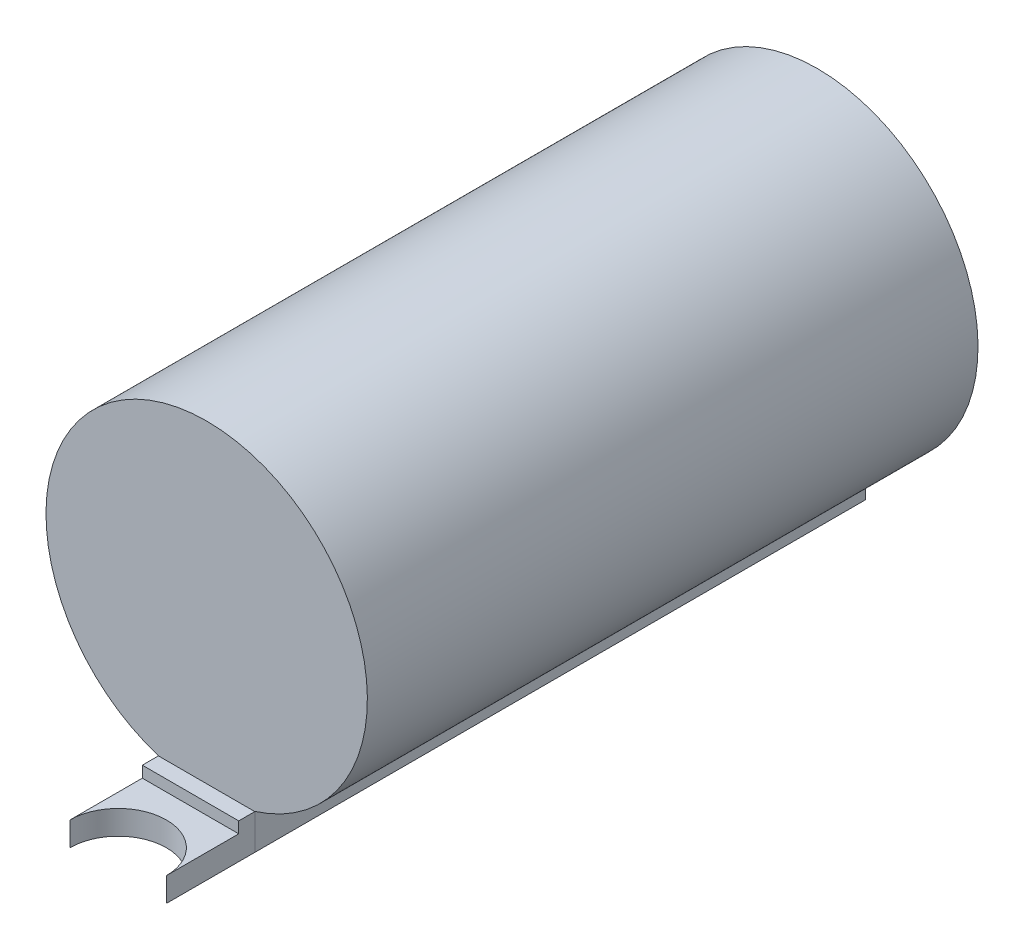
ISO-10303-21;
HEADER;
FILE_DESCRIPTION(('STEP AP214'),'2;1');
FILE_NAME('part.step','',(''),(''),'','','');
FILE_SCHEMA(('AUTOMOTIVE_DESIGN { 1 0 10303 214 1 1 1 1 }'));
ENDSEC;
DATA;
#1=APPLICATION_CONTEXT('core data for automotive mechanical design processes');
#2=APPLICATION_PROTOCOL_DEFINITION('international standard','automotive_design',2000,#1);
#3=PRODUCT_CONTEXT('',#1,'mechanical');
#4=PRODUCT('Part','Part','',(#3));
#5=PRODUCT_RELATED_PRODUCT_CATEGORY('part','',(#4));
#6=PRODUCT_DEFINITION_FORMATION('','',#4);
#7=PRODUCT_DEFINITION_CONTEXT('part definition',#1,'design');
#8=PRODUCT_DEFINITION('design','',#6,#7);
#9=PRODUCT_DEFINITION_SHAPE('','',#8);
#10=(LENGTH_UNIT() NAMED_UNIT(*) SI_UNIT(.MILLI.,.METRE.));
#11=(NAMED_UNIT(*) PLANE_ANGLE_UNIT() SI_UNIT($,.RADIAN.));
#12=(NAMED_UNIT(*) SI_UNIT($,.STERADIAN.) SOLID_ANGLE_UNIT());
#13=UNCERTAINTY_MEASURE_WITH_UNIT(LENGTH_MEASURE(1.E-05),#10,'distance_accuracy_value','');
#14=(GEOMETRIC_REPRESENTATION_CONTEXT(3) GLOBAL_UNCERTAINTY_ASSIGNED_CONTEXT((#13)) GLOBAL_UNIT_ASSIGNED_CONTEXT((#10,
#11,#12)) REPRESENTATION_CONTEXT('',''));
#15=CARTESIAN_POINT('',(0.,0.,0.));
#16=DIRECTION('',(0.,0.,1.));
#17=DIRECTION('',(1.,0.,0.));
#18=AXIS2_PLACEMENT_3D('',#15,#16,#17);
#19=CARTESIAN_POINT('',(52.9064217876975,86.5918418577078,263.612049091514));
#20=DIRECTION('',(0.000492573763945785,0.999999878685536,0.));
#21=DIRECTION('',(0.,0.,-1.));
#22=AXIS2_PLACEMENT_3D('',#19,#20,#21);
#23=PLANE('',#22);
#24=CARTESIAN_POINT('',(52.9064219934912,86.5918418576064,266.612049091514));
#25=DIRECTION('',(0.00049257376394578,0.999999878685536,0.));
#26=DIRECTION('',(0.999999878685536,-0.00049257376394578,0.));
#27=AXIS2_PLACEMENT_3D('',#24,#25,#26);
#28=CIRCLE('',#27,6.);
#29=CARTESIAN_POINT('',(58.9064208540171,86.5888864152255,266.612049091514));
#30=VERTEX_POINT('',#29);
#31=CARTESIAN_POINT('',(46.9064223097906,86.5947973003929,266.612049091514));
#32=VERTEX_POINT('',#31);
#33=EDGE_CURVE('P0_E11',#30,#32,#28,.T.);
#34=ORIENTED_EDGE('',*,*,#33,.T.);
#35=DIRECTION('',(0.,0.,1.));
#36=VECTOR('',#35,1.);
#37=CARTESIAN_POINT('',(46.9064223097906,86.5947973003929,179.612049091514));
#38=LINE('',#37,#36);
#39=CARTESIAN_POINT('',(46.9064226282379,86.594797300236,255.612049091514));
#40=VERTEX_POINT('',#39);
#41=EDGE_CURVE('P0_E129',#40,#32,#38,.T.);
#42=ORIENTED_EDGE('',*,*,#41,.F.);
#43=DIRECTION('',(0.999999878685536,-0.000492573763945785,0.));
#44=VECTOR('',#43,1.);
#45=CARTESIAN_POINT('',(46.9064226282379,86.594797300236,255.612049091514));
#46=LINE('',#45,#44);
#47=CARTESIAN_POINT('',(58.9064212656044,86.5888864150228,255.612049091514));
#48=VERTEX_POINT('',#47);
#49=EDGE_CURVE('P0_E26',#40,#48,#46,.T.);
#50=ORIENTED_EDGE('',*,*,#49,.T.);
#51=DIRECTION('',(0.,0.,-1.));
#52=VECTOR('',#51,1.);
#53=CARTESIAN_POINT('',(58.9064208540171,86.5888864152255,347.612049091514));
#54=LINE('',#53,#52);
#55=EDGE_CURVE('P0_E125',#30,#48,#54,.T.);
#56=ORIENTED_EDGE('',*,*,#55,.F.);
#57=EDGE_LOOP('',(#34,#42,#50,#56));
#58=FACE_BOUND('',#57,.T.);
#59=ADVANCED_FACE('P0_F17',(#58),#23,.F.);
#60=CARTESIAN_POINT('',(52.9064219934912,86.5918418576064,266.612049091514));
#61=DIRECTION('',(0.000492573763945051,0.999999878685536,0.));
#62=DIRECTION('',(0.999999878685536,-0.000492573763945051,0.));
#63=AXIS2_PLACEMENT_3D('',#60,#61,#62);
#64=CYLINDRICAL_SURFACE('',#63,6.);
#65=CARTESIAN_POINT('',(52.9078997134501,89.5918387876671,266.612049091514));
#66=DIRECTION('',(1.18373358628426E-11,1.,0.));
#67=DIRECTION('',(1.,-1.18373358628426E-11,0.));
#68=AXIS2_PLACEMENT_3D('',#65,#66,#67);
#69=CIRCLE('',#68,6.00000072788684);
#70=CARTESIAN_POINT('',(58.9079000297495,89.5918387875961,266.612049091514));
#71=VERTEX_POINT('',#70);
#72=CARTESIAN_POINT('',(46.9078985739758,89.5918387877381,266.612049091514));
#73=VERTEX_POINT('',#72);
#74=EDGE_CURVE('P0_E103',#71,#73,#69,.T.);
#75=ORIENTED_EDGE('',*,*,#74,.T.);
#76=DIRECTION('',(0.000492573763945056,0.999999878685536,0.));
#77=VECTOR('',#76,1.);
#78=CARTESIAN_POINT('',(46.9064223097906,86.5947973003929,266.612049091514));
#79=LINE('',#78,#77);
#80=EDGE_CURVE('P0_E98',#32,#73,#79,.T.);
#81=ORIENTED_EDGE('',*,*,#80,.F.);
#82=ORIENTED_EDGE('',*,*,#33,.F.);
#83=DIRECTION('',(0.000492573763945056,0.999999878685536,0.));
#84=VECTOR('',#83,1.);
#85=CARTESIAN_POINT('',(58.9064208540171,86.5888864152255,266.612049091514));
#86=LINE('',#85,#84);
#87=EDGE_CURVE('P0_E132',#30,#71,#86,.T.);
#88=ORIENTED_EDGE('',*,*,#87,.T.);
#89=EDGE_LOOP('',(#75,#81,#82,#88));
#90=FACE_BOUND('',#89,.T.);
#91=ADVANCED_FACE('P0_F195',(#90),#64,.F.);
#92=CARTESIAN_POINT('',(58.9064212656044,86.5888864150228,255.612049091514));
#93=DIRECTION('',(0.,0.,-1.));
#94=DIRECTION('',(0.,-1.,0.));
#95=AXIS2_PLACEMENT_3D('',#92,#93,#94);
#96=PLANE('',#95);
#97=ORIENTED_EDGE('',*,*,#49,.F.);
#98=DIRECTION('',(0.000492573763945056,0.999999878685536,0.));
#99=VECTOR('',#98,1.);
#100=CARTESIAN_POINT('',(46.9064226282379,86.594797300236,255.612049091514));
#101=LINE('',#100,#99);
#102=CARTESIAN_POINT('',(46.9085899527993,90.9947967664523,255.612049091514));
#103=VERTEX_POINT('',#102);
#104=EDGE_CURVE('P0_E124',#40,#103,#101,.T.);
#105=ORIENTED_EDGE('',*,*,#104,.T.);
#106=DIRECTION('',(-0.999999878685536,0.000492573763945785,0.));
#107=VECTOR('',#106,1.);
#108=CARTESIAN_POINT('',(46.9085899527993,90.9947967664524,255.612049091514));
#109=LINE('',#108,#107);
#110=CARTESIAN_POINT('',(58.9085885901658,90.9888858812391,255.612049091514));
#111=VERTEX_POINT('',#110);
#112=EDGE_CURVE('P0_E145',#111,#103,#109,.T.);
#113=ORIENTED_EDGE('',*,*,#112,.F.);
#114=DIRECTION('',(0.000492573763945056,0.999999878685536,0.));
#115=VECTOR('',#114,1.);
#116=CARTESIAN_POINT('',(58.9064212656044,86.5888864150228,255.612049091514));
#117=LINE('',#116,#115);
#118=EDGE_CURVE('P0_E123',#48,#111,#117,.T.);
#119=ORIENTED_EDGE('',*,*,#118,.F.);
#120=EDGE_LOOP('',(#97,#105,#113,#119));
#121=FACE_BOUND('',#120,.T.);
#122=ADVANCED_FACE('P0_F190',(#121),#96,.T.);
#123=CARTESIAN_POINT('',(46.9064223097906,86.5947973003929,255.612049091514));
#124=DIRECTION('',(-0.999999878685536,0.000492573763945056,0.));
#125=DIRECTION('',(0.,0.,1.));
#126=AXIS2_PLACEMENT_3D('',#123,#124,#125);
#127=PLANE('',#126);
#128=DIRECTION('',(0.000492573763945056,0.999999878685536,0.));
#129=VECTOR('',#128,1.);
#130=CARTESIAN_POINT('',(46.912210051463,98.3447957653246,257.612049091514));
#131=LINE('',#130,#129);
#132=CARTESIAN_POINT('',(46.9078985739758,89.5918387877381,257.612049091514));
#133=VERTEX_POINT('',#132);
#134=CARTESIAN_POINT('',(46.908589634352,90.9947967666092,257.612049091514));
#135=VERTEX_POINT('',#134);
#136=EDGE_CURVE('P0_E96',#133,#135,#131,.T.);
#137=ORIENTED_EDGE('',*,*,#136,.T.);
#138=DIRECTION('',(0.,0.,1.));
#139=VECTOR('',#138,1.);
#140=CARTESIAN_POINT('',(46.908589634352,90.9947967666092,179.612049091514));
#141=LINE('',#140,#139);
#142=EDGE_CURVE('P0_E83',#103,#135,#141,.T.);
#143=ORIENTED_EDGE('',*,*,#142,.F.);
#144=ORIENTED_EDGE('',*,*,#104,.F.);
#145=ORIENTED_EDGE('',*,*,#41,.T.);
#146=ORIENTED_EDGE('',*,*,#80,.T.);
#147=DIRECTION('',(0.,0.,-1.));
#148=VECTOR('',#147,1.);
#149=CARTESIAN_POINT('',(46.9078985739758,89.5918387877381,301.612049091514));
#150=LINE('',#149,#148);
#151=EDGE_CURVE('P0_E92',#73,#133,#150,.T.);
#152=ORIENTED_EDGE('',*,*,#151,.T.);
#153=EDGE_LOOP('',(#137,#143,#144,#145,#146,#152));
#154=FACE_BOUND('',#153,.T.);
#155=ADVANCED_FACE('P0_F94',(#154),#127,.T.);
#156=CARTESIAN_POINT('',(58.9064208540171,86.5888864152255,266.612049091514));
#157=DIRECTION('',(0.999999878685536,-0.000492573763945056,0.));
#158=DIRECTION('',(0.,0.,-1.));
#159=AXIS2_PLACEMENT_3D('',#156,#157,#158);
#160=PLANE('',#159);
#161=DIRECTION('',(-0.000492573763945056,-0.999999878685536,0.));
#162=VECTOR('',#161,1.);
#163=CARTESIAN_POINT('',(58.9122085956894,98.3388848801572,257.612049091514));
#164=LINE('',#163,#162);
#165=CARTESIAN_POINT('',(58.9085881785784,90.9888858814419,257.612049091514));
#166=VERTEX_POINT('',#165);
#167=CARTESIAN_POINT('',(58.9079000297495,89.591838787596,257.612049091514));
#168=VERTEX_POINT('',#167);
#169=EDGE_CURVE('P0_E115',#166,#168,#164,.T.);
#170=ORIENTED_EDGE('',*,*,#169,.T.);
#171=DIRECTION('',(0.,0.,1.));
#172=VECTOR('',#171,1.);
#173=CARTESIAN_POINT('',(58.9079000297495,89.5918387875961,307.112049091514));
#174=LINE('',#173,#172);
#175=EDGE_CURVE('P0_E110',#168,#71,#174,.T.);
#176=ORIENTED_EDGE('',*,*,#175,.T.);
#177=ORIENTED_EDGE('',*,*,#87,.F.);
#178=ORIENTED_EDGE('',*,*,#55,.T.);
#179=ORIENTED_EDGE('',*,*,#118,.T.);
#180=DIRECTION('',(0.,0.,-1.));
#181=VECTOR('',#180,1.);
#182=CARTESIAN_POINT('',(58.9085881785784,90.9888858814419,347.612049091514));
#183=LINE('',#182,#181);
#184=EDGE_CURVE('P0_E141',#166,#111,#183,.T.);
#185=ORIENTED_EDGE('',*,*,#184,.F.);
#186=EDGE_LOOP('',(#170,#176,#177,#178,#179,#185));
#187=FACE_BOUND('',#186,.T.);
#188=ADVANCED_FACE('P0_F172',(#187),#160,.T.);
#189=CARTESIAN_POINT('',(52.9085891122589,90.9918413239242,263.612049091514));
#190=DIRECTION('',(0.000492573763945785,0.999999878685536,0.));
#191=DIRECTION('',(0.,0.,-1.));
#192=AXIS2_PLACEMENT_3D('',#189,#190,#191);
#193=PLANE('',#192);
#194=DIRECTION('',(0.999999878685536,-0.000492573763945785,0.));
#195=VECTOR('',#194,1.);
#196=CARTESIAN_POINT('',(52.9085890150781,90.9918413239721,257.612049091514));
#197=LINE('',#196,#195);
#198=EDGE_CURVE('P0_E104',#135,#166,#197,.T.);
#199=ORIENTED_EDGE('',*,*,#198,.T.);
#200=ORIENTED_EDGE('',*,*,#184,.T.);
#201=ORIENTED_EDGE('',*,*,#112,.T.);
#202=ORIENTED_EDGE('',*,*,#142,.T.);
#203=EDGE_LOOP('',(#199,#200,#201,#202));
#204=FACE_BOUND('',#203,.T.);
#205=ADVANCED_FACE('P0_F177',(#204),#193,.T.);
#206=CARTESIAN_POINT('',(64.7536775948253,89.5918387875269,347.612049091514));
#207=DIRECTION('',(-1.18373358080693E-11,-1.,0.));
#208=DIRECTION('',(-1.,1.18373358080693E-11,0.));
#209=AXIS2_PLACEMENT_3D('',#206,#207,#208);
#210=PLANE('',#209);
#211=ORIENTED_EDGE('',*,*,#151,.F.);
#212=ORIENTED_EDGE('',*,*,#74,.F.);
#213=ORIENTED_EDGE('',*,*,#175,.F.);
#214=DIRECTION('',(-1.,1.18373358080693E-11,0.));
#215=VECTOR('',#214,1.);
#216=CARTESIAN_POINT('',(41.0823165580506,89.5918387878071,257.612049091514));
#217=LINE('',#216,#215);
#218=EDGE_CURVE('P0_E107',#168,#133,#217,.T.);
#219=ORIENTED_EDGE('',*,*,#218,.T.);
#220=EDGE_LOOP('',(#211,#212,#213,#219));
#221=FACE_BOUND('',#220,.T.);
#222=ADVANCED_FACE('P0_F108',(#221),#210,.F.);
#223=CARTESIAN_POINT('',(52.9179970766806,110.091838787667,257.612049091514));
#224=DIRECTION('',(0.,0.,-1.));
#225=DIRECTION('',(0.,-1.,0.));
#226=AXIS2_PLACEMENT_3D('',#223,#224,#225);
#227=PLANE('',#226);
#228=ORIENTED_EDGE('',*,*,#136,.F.);
#229=ORIENTED_EDGE('',*,*,#218,.F.);
#230=ORIENTED_EDGE('',*,*,#169,.F.);
#231=ORIENTED_EDGE('',*,*,#198,.F.);
#232=EDGE_LOOP('',(#228,#229,#230,#231));
#233=FACE_BOUND('',#232,.T.);
#234=ADVANCED_FACE('P0_F117',(#233),#227,.F.);
#235=CLOSED_SHELL('',(#59,#91,#122,#155,#188,#205,#222,#234));
#236=MANIFOLD_SOLID_BREP('P0_B1',#235);
#237=CARTESIAN_POINT('',(52.9179974421289,110.091839662489,255.612052894942));
#238=DIRECTION('',(0.,0.,-1.));
#239=DIRECTION('',(0.,-1.,0.));
#240=AXIS2_PLACEMENT_3D('',#237,#238,#239);
#241=PLANE('',#240);
#242=CARTESIAN_POINT('',(52.9179974421289,110.091839662489,255.612049091514));
#243=DIRECTION('',(0.,0.,1.));
#244=DIRECTION('',(-0.300469849497518,-0.953791313413442,0.));
#245=AXIS2_PLACEMENT_3D('',#242,#243,#244);
#246=CIRCLE('',#245,20.0000001552334);
#247=CARTESIAN_POINT('',(58.9085990430932,91.0101023551087,255.612049091514));
#248=VERTEX_POINT('',#247);
#249=CARTESIAN_POINT('',(46.9086004055356,91.0160132461597,255.612049091514));
#250=VERTEX_POINT('',#249);
#251=EDGE_CURVE('P1_E11',#248,#250,#246,.T.);
#252=ORIENTED_EDGE('',*,*,#251,.T.);
#253=DIRECTION('',(-0.000492574228476324,-0.999999878685307,0.));
#254=VECTOR('',#253,1.);
#255=CARTESIAN_POINT('',(46.9086004055356,91.0160132461597,255.612049091514));
#256=LINE('',#255,#254);
#257=CARTESIAN_POINT('',(46.9064226284725,86.5947977765105,255.612049091514));
#258=VERTEX_POINT('',#257);
#259=EDGE_CURVE('P1_E107',#250,#258,#256,.T.);
#260=ORIENTED_EDGE('',*,*,#259,.T.);
#261=DIRECTION('',(0.999999878685297,-0.000492574250416253,0.));
#262=VECTOR('',#261,1.);
#263=CARTESIAN_POINT('',(46.9064226284725,86.5947977765105,255.612049091514));
#264=LINE('',#263,#262);
#265=CARTESIAN_POINT('',(58.9064212658362,86.5888868854596,255.612049091514));
#266=VERTEX_POINT('',#265);
#267=EDGE_CURVE('P1_E65',#258,#266,#264,.T.);
#268=ORIENTED_EDGE('',*,*,#267,.T.);
#269=DIRECTION('',(0.000492574272355537,0.999999878685286,0.));
#270=VECTOR('',#269,1.);
#271=CARTESIAN_POINT('',(58.9064212658362,86.5888868854596,255.612049091514));
#272=LINE('',#271,#270);
#273=EDGE_CURVE('P1_E94',#266,#248,#272,.T.);
#274=ORIENTED_EDGE('',*,*,#273,.T.);
#275=EDGE_LOOP('',(#252,#260,#268,#274));
#276=FACE_BOUND('',#275,.T.);
#277=ADVANCED_FACE('P1_F17',(#276),#241,.F.);
#278=CARTESIAN_POINT('',(52.9179974421289,110.091839662489,179.612052894942));
#279=DIRECTION('',(0.,0.,-1.));
#280=DIRECTION('',(0.,-1.,0.));
#281=AXIS2_PLACEMENT_3D('',#278,#279,#280);
#282=PLANE('',#281);
#283=CARTESIAN_POINT('',(52.9179974421289,110.091839662489,179.612049091514));
#284=DIRECTION('',(0.,0.,-1.));
#285=DIRECTION('',(-0.300469849497518,-0.953791313413442,0.));
#286=AXIS2_PLACEMENT_3D('',#283,#284,#285);
#287=CIRCLE('',#286,20.0000001552334);
#288=CARTESIAN_POINT('',(46.9086004055356,91.0160132461597,179.612049091514));
#289=VERTEX_POINT('',#288);
#290=CARTESIAN_POINT('',(58.9085990430932,91.0101023551087,179.612049091514));
#291=VERTEX_POINT('',#290);
#292=EDGE_CURVE('P1_E25',#289,#291,#287,.T.);
#293=ORIENTED_EDGE('',*,*,#292,.T.);
#294=DIRECTION('',(0.000492574272355537,0.999999878685286,0.));
#295=VECTOR('',#294,1.);
#296=CARTESIAN_POINT('',(58.9064212658362,86.5888868854596,179.612049091514));
#297=LINE('',#296,#295);
#298=CARTESIAN_POINT('',(58.9064212658362,86.5888868854596,179.612049091514));
#299=VERTEX_POINT('',#298);
#300=EDGE_CURVE('P1_E93',#299,#291,#297,.T.);
#301=ORIENTED_EDGE('',*,*,#300,.F.);
#302=DIRECTION('',(0.999999878685297,-0.000492574250416253,0.));
#303=VECTOR('',#302,1.);
#304=CARTESIAN_POINT('',(46.9064226284725,86.5947977765105,179.612049091514));
#305=LINE('',#304,#303);
#306=CARTESIAN_POINT('',(46.9064226284725,86.5947977765105,179.612049091514));
#307=VERTEX_POINT('',#306);
#308=EDGE_CURVE('P1_E79',#307,#299,#305,.T.);
#309=ORIENTED_EDGE('',*,*,#308,.F.);
#310=DIRECTION('',(-0.000492574228476324,-0.999999878685307,0.));
#311=VECTOR('',#310,1.);
#312=CARTESIAN_POINT('',(46.9086004055356,91.0160132461597,179.612049091514));
#313=LINE('',#312,#311);
#314=EDGE_CURVE('P1_E58',#289,#307,#313,.T.);
#315=ORIENTED_EDGE('',*,*,#314,.F.);
#316=EDGE_LOOP('',(#293,#301,#309,#315));
#317=FACE_BOUND('',#316,.T.);
#318=ADVANCED_FACE('P1_F97',(#317),#282,.T.);
#319=CARTESIAN_POINT('',(52.9179974421289,110.091839662489,179.612049091514));
#320=DIRECTION('',(0.,0.,1.));
#321=DIRECTION('',(0.000492574250415287,0.999999878685296,0.));
#322=AXIS2_PLACEMENT_3D('',#319,#320,#321);
#323=CYLINDRICAL_SURFACE('',#322,20.0000001552334);
#324=ORIENTED_EDGE('',*,*,#292,.F.);
#325=DIRECTION('',(0.,0.,1.));
#326=VECTOR('',#325,1.);
#327=CARTESIAN_POINT('',(46.9086004055356,91.0160132461597,179.612049091514));
#328=LINE('',#327,#326);
#329=EDGE_CURVE('P1_E106',#289,#250,#328,.T.);
#330=ORIENTED_EDGE('',*,*,#329,.T.);
#331=ORIENTED_EDGE('',*,*,#251,.F.);
#332=DIRECTION('',(0.,0.,1.));
#333=VECTOR('',#332,1.);
#334=CARTESIAN_POINT('',(58.9085990430932,91.0101023551087,179.612049091514));
#335=LINE('',#334,#333);
#336=EDGE_CURVE('P1_E99',#291,#248,#335,.T.);
#337=ORIENTED_EDGE('',*,*,#336,.F.);
#338=EDGE_LOOP('',(#324,#330,#331,#337));
#339=FACE_BOUND('',#338,.T.);
#340=ADVANCED_FACE('P1_F146',(#339),#323,.T.);
#341=CARTESIAN_POINT('',(46.9086004055356,91.0160132461597,179.612049091514));
#342=DIRECTION('',(-0.999999878685307,0.000492574228476324,0.));
#343=DIRECTION('',(0.,0.,1.));
#344=AXIS2_PLACEMENT_3D('',#341,#342,#343);
#345=PLANE('',#344);
#346=ORIENTED_EDGE('',*,*,#314,.T.);
#347=DIRECTION('',(0.,0.,1.));
#348=VECTOR('',#347,1.);
#349=CARTESIAN_POINT('',(46.9064226284725,86.5947977765105,179.612049091514));
#350=LINE('',#349,#348);
#351=EDGE_CURVE('P1_E84',#307,#258,#350,.T.);
#352=ORIENTED_EDGE('',*,*,#351,.T.);
#353=ORIENTED_EDGE('',*,*,#259,.F.);
#354=ORIENTED_EDGE('',*,*,#329,.F.);
#355=EDGE_LOOP('',(#346,#352,#353,#354));
#356=FACE_BOUND('',#355,.T.);
#357=ADVANCED_FACE('P1_F137',(#356),#345,.T.);
#358=CARTESIAN_POINT('',(46.9064226284725,86.5947977765105,179.612049091514));
#359=DIRECTION('',(-0.000492574250416253,-0.999999878685296,0.));
#360=DIRECTION('',(-0.999999878685296,0.000492574250416253,0.));
#361=AXIS2_PLACEMENT_3D('',#358,#359,#360);
#362=PLANE('',#361);
#363=ORIENTED_EDGE('',*,*,#308,.T.);
#364=DIRECTION('',(0.,0.,1.));
#365=VECTOR('',#364,1.);
#366=CARTESIAN_POINT('',(58.9064212658362,86.5888868854596,179.612049091514));
#367=LINE('',#366,#365);
#368=EDGE_CURVE('P1_E82',#299,#266,#367,.T.);
#369=ORIENTED_EDGE('',*,*,#368,.T.);
#370=ORIENTED_EDGE('',*,*,#267,.F.);
#371=ORIENTED_EDGE('',*,*,#351,.F.);
#372=EDGE_LOOP('',(#363,#369,#370,#371));
#373=FACE_BOUND('',#372,.T.);
#374=ADVANCED_FACE('P1_F81',(#373),#362,.T.);
#375=CARTESIAN_POINT('',(58.9064212658362,86.5888868854596,179.612049091514));
#376=DIRECTION('',(0.999999878685286,-0.000492574272355537,0.));
#377=DIRECTION('',(0.,0.,-1.));
#378=AXIS2_PLACEMENT_3D('',#375,#376,#377);
#379=PLANE('',#378);
#380=ORIENTED_EDGE('',*,*,#300,.T.);
#381=ORIENTED_EDGE('',*,*,#336,.T.);
#382=ORIENTED_EDGE('',*,*,#273,.F.);
#383=ORIENTED_EDGE('',*,*,#368,.F.);
#384=EDGE_LOOP('',(#380,#381,#382,#383));
#385=FACE_BOUND('',#384,.T.);
#386=ADVANCED_FACE('P1_F91',(#385),#379,.T.);
#387=CLOSED_SHELL('',(#277,#318,#340,#357,#374,#386));
#388=MANIFOLD_SOLID_BREP('P1_B1',#387);
#389=ADVANCED_BREP_SHAPE_REPRESENTATION('',(#18,#236,#388),#14);
#390=SHAPE_DEFINITION_REPRESENTATION(#9,#389);
ENDSEC;
END-ISO-10303-21;
